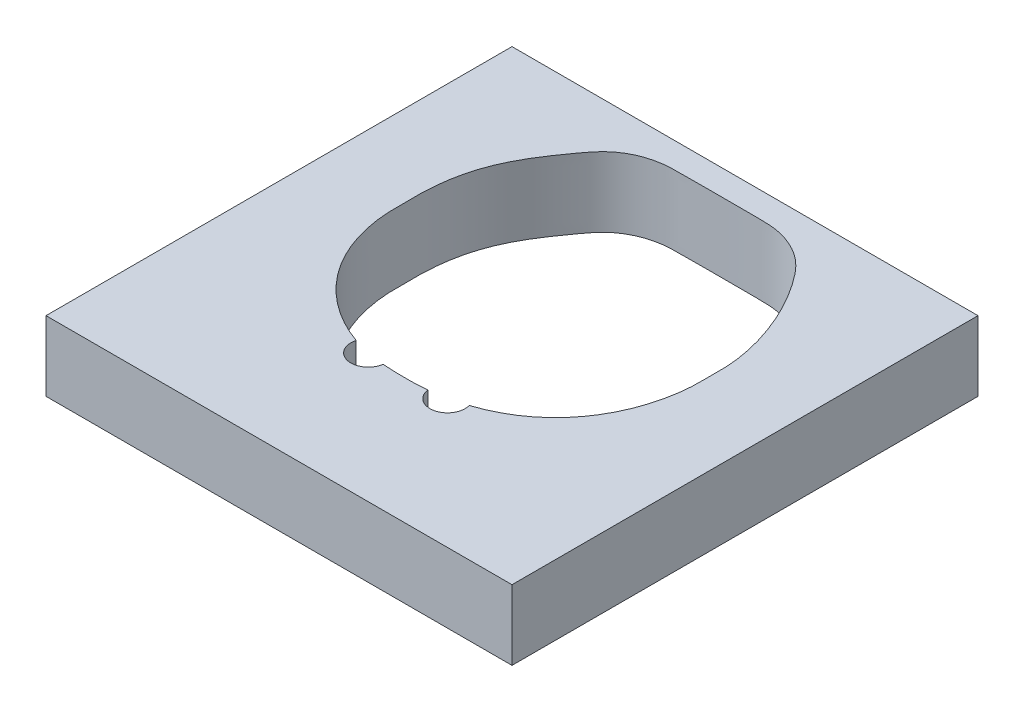
ISO-10303-21;
HEADER;
FILE_DESCRIPTION(('STEP AP214'),'2;1');
FILE_NAME('part.step','',(''),(''),'','','');
FILE_SCHEMA(('AUTOMOTIVE_DESIGN { 1 0 10303 214 1 1 1 1 }'));
ENDSEC;
DATA;
#1=APPLICATION_CONTEXT('core data for automotive mechanical design processes');
#2=APPLICATION_PROTOCOL_DEFINITION('international standard','automotive_design',2000,#1);
#3=PRODUCT_CONTEXT('',#1,'mechanical');
#4=PRODUCT('Part','Part','',(#3));
#5=PRODUCT_RELATED_PRODUCT_CATEGORY('part','',(#4));
#6=PRODUCT_DEFINITION_FORMATION('','',#4);
#7=PRODUCT_DEFINITION_CONTEXT('part definition',#1,'design');
#8=PRODUCT_DEFINITION('design','',#6,#7);
#9=PRODUCT_DEFINITION_SHAPE('','',#8);
#10=(LENGTH_UNIT() NAMED_UNIT(*) SI_UNIT(.MILLI.,.METRE.));
#11=(NAMED_UNIT(*) PLANE_ANGLE_UNIT() SI_UNIT($,.RADIAN.));
#12=(NAMED_UNIT(*) SI_UNIT($,.STERADIAN.) SOLID_ANGLE_UNIT());
#13=UNCERTAINTY_MEASURE_WITH_UNIT(LENGTH_MEASURE(1.E-05),#10,'distance_accuracy_value','');
#14=(GEOMETRIC_REPRESENTATION_CONTEXT(3) GLOBAL_UNCERTAINTY_ASSIGNED_CONTEXT((#13)) GLOBAL_UNIT_ASSIGNED_CONTEXT((#10,
#11,#12)) REPRESENTATION_CONTEXT('',''));
#15=CARTESIAN_POINT('',(0.,0.,0.));
#16=DIRECTION('',(0.,0.,1.));
#17=DIRECTION('',(1.,0.,0.));
#18=AXIS2_PLACEMENT_3D('',#15,#16,#17);
#19=CARTESIAN_POINT('',(-6.5,3.,-0.0214256179021365));
#20=CARTESIAN_POINT('',(-6.4994353161605,3.,0.000766677463345946));
#21=CARTESIAN_POINT('',(-6.49376389361778,3.,0.201339556868942));
#22=CARTESIAN_POINT('',(-6.51696723816189,3.,0.772884175907258));
#23=CARTESIAN_POINT('',(-6.12276332573033,3.,4.40404440112664));
#24=CARTESIAN_POINT('',(-3.09115744061249,3.,6.47833918697403));
#25=CARTESIAN_POINT('',(-0.424881736383483,3.,6.60745043523645));
#26=CARTESIAN_POINT('',(0.542300842859808,3.,6.62004418470608));
#27=CARTESIAN_POINT('',(4.32532450355847,3.,6.18245181467968));
#28=CARTESIAN_POINT('',(6.24560432473159,3.,3.43668929001936));
#29=CARTESIAN_POINT('',(6.5123854251507,3.,0.674969758176274));
#30=CARTESIAN_POINT('',(6.49432132460375,3.,0.00635575368141149));
#31=CARTESIAN_POINT('',(6.5548121704122,3.,-1.82425774874944));
#32=CARTESIAN_POINT('',(5.68383722274038,3.,-4.18292822463381));
#33=CARTESIAN_POINT('',(3.91331243357122,3.,-6.39372429564908));
#34=CARTESIAN_POINT('',(2.76238786705689,3.,-6.89457598920464));
#35=CARTESIAN_POINT('',(1.13006599908281,3.,-6.9136657002627));
#36=CARTESIAN_POINT('',(-0.878751888485847,3.,-6.91216839268337));
#37=CARTESIAN_POINT('',(-2.75816083109723,3.,-6.89927622220035));
#38=CARTESIAN_POINT('',(-3.9036762031933,3.,-6.44685242777281));
#39=CARTESIAN_POINT('',(-5.63278238136855,3.,-4.10255317192324));
#40=CARTESIAN_POINT('',(-6.56506313779724,3.,-2.57843233637398));
#41=CARTESIAN_POINT('',(-6.5,3.,-0.0214256179021365));
#42=B_SPLINE_CURVE_WITH_KNOTS('',3,(#19,#20,#21,#22,#23,#24,#25,#26,#27,#28,#29,#30,#31,#32,#33,
#34,#35,#36,#37,#38,#39,#40,#41),.UNSPECIFIED.,.T.,.F.,(4,1,1,1,1,1,1,1,1,1,1,1,1,1,1,1,1,1,1,1,
4),(0.,0.000975276685882154,0.00877749017293927,0.0280867828451107,0.174758910735425,
0.195439600970171,0.214212994957821,0.243278903751987,0.457032780117661,0.48570437028444,
0.501323215252997,0.520309432280292,0.656580323530094,0.680219271622173,0.733059965108999,
0.747794653096474,0.812831463509451,0.826379198459506,0.869724267646966,0.887628161165858,
0.999999999999999),.UNSPECIFIED.);
#43=DIRECTION('',(0.,-1.,0.));
#44=VECTOR('',#43,1.);
#45=SURFACE_OF_LINEAR_EXTRUSION('',#42,#44);
#46=DIRECTION('',(0.,-1.,0.));
#47=VECTOR('',#46,1.);
#48=CARTESIAN_POINT('',(-2.4219901361144,3.,6.26463301470741));
#49=LINE('',#48,#47);
#50=CARTESIAN_POINT('',(-2.42199013611445,0.,6.2646330147074));
#51=VERTEX_POINT('',#50);
#52=CARTESIAN_POINT('',(-2.42199013611445,3.,6.2646330147074));
#53=VERTEX_POINT('',#52);
#54=EDGE_CURVE('E11',#51,#53,#49,.F.);
#55=ORIENTED_EDGE('',*,*,#54,.F.);
#56=CARTESIAN_POINT('',(-6.5,0.,-0.0214256179021365));
#57=CARTESIAN_POINT('',(-6.4994353161605,0.,0.000766677463345946));
#58=CARTESIAN_POINT('',(-6.49376389361778,0.,0.201339556868942));
#59=CARTESIAN_POINT('',(-6.51696723816189,0.,0.772884175907258));
#60=CARTESIAN_POINT('',(-6.12276332573033,0.,4.40404440112664));
#61=CARTESIAN_POINT('',(-3.09115744061249,0.,6.47833918697403));
#62=CARTESIAN_POINT('',(-0.424881736383483,0.,6.60745043523645));
#63=CARTESIAN_POINT('',(0.542300842859808,0.,6.62004418470608));
#64=CARTESIAN_POINT('',(4.32532450355847,0.,6.18245181467968));
#65=CARTESIAN_POINT('',(6.24560432473159,0.,3.43668929001936));
#66=CARTESIAN_POINT('',(6.5123854251507,0.,0.674969758176274));
#67=CARTESIAN_POINT('',(6.49432132460375,0.,0.00635575368141149));
#68=CARTESIAN_POINT('',(6.5548121704122,0.,-1.82425774874944));
#69=CARTESIAN_POINT('',(5.68383722274038,0.,-4.18292822463381));
#70=CARTESIAN_POINT('',(3.91331243357122,0.,-6.39372429564908));
#71=CARTESIAN_POINT('',(2.76238786705689,0.,-6.89457598920464));
#72=CARTESIAN_POINT('',(1.13006599908281,0.,-6.9136657002627));
#73=CARTESIAN_POINT('',(-0.878751888485847,0.,-6.91216839268337));
#74=CARTESIAN_POINT('',(-2.75816083109723,0.,-6.89927622220035));
#75=CARTESIAN_POINT('',(-3.9036762031933,0.,-6.44685242777281));
#76=CARTESIAN_POINT('',(-5.63278238136855,0.,-4.10255317192324));
#77=CARTESIAN_POINT('',(-6.56506313779724,0.,-2.57843233637398));
#78=CARTESIAN_POINT('',(-6.5,0.,-0.0214256179021365));
#79=B_SPLINE_CURVE_WITH_KNOTS('',3,(#56,#57,#58,#59,#60,#61,#62,#63,#64,#65,#66,#67,#68,#69,#70,
#71,#72,#73,#74,#75,#76,#77,#78),.UNSPECIFIED.,.T.,.F.,(4,1,1,1,1,1,1,1,1,1,1,1,1,1,1,1,1,1,1,1,
4),(0.,0.000975276685882154,0.00877749017293927,0.0280867828451107,0.174758910735425,
0.195439600970171,0.214212994957821,0.243278903751987,0.457032780117661,0.48570437028444,
0.501323215252997,0.520309432280292,0.656580323530094,0.680219271622173,0.733059965108999,
0.747794653096474,0.812831463509451,0.826379198459506,0.869724267646966,0.887628161165858,
0.999999999999999),.UNSPECIFIED.);
#80=CARTESIAN_POINT('',(2.41963726154094,0.,6.25644562925793));
#81=VERTEX_POINT('',#80);
#82=EDGE_CURVE('E130',#81,#51,#79,.T.);
#83=ORIENTED_EDGE('',*,*,#82,.F.);
#84=DIRECTION('',(0.,-1.,0.));
#85=VECTOR('',#84,1.);
#86=CARTESIAN_POINT('',(2.41963726154094,3.,6.25644562925793));
#87=LINE('',#86,#85);
#88=CARTESIAN_POINT('',(2.41963726154094,3.,6.25644562925793));
#89=VERTEX_POINT('',#88);
#90=EDGE_CURVE('E107',#89,#81,#87,.T.);
#91=ORIENTED_EDGE('',*,*,#90,.F.);
#92=EDGE_CURVE('E116',#89,#53,#42,.T.);
#93=ORIENTED_EDGE('',*,*,#92,.T.);
#94=EDGE_LOOP('',(#55,#83,#91,#93));
#95=FACE_BOUND('',#94,.T.);
#96=ADVANCED_FACE('F37',(#95),#45,.T.);
#97=CARTESIAN_POINT('',(0.,3.,0.));
#98=DIRECTION('',(0.,1.,0.));
#99=DIRECTION('',(0.,0.,1.));
#100=AXIS2_PLACEMENT_3D('',#97,#98,#99);
#101=PLANE('',#100);
#102=CARTESIAN_POINT('',(-1.7,3.,6.46768533149653));
#103=DIRECTION('',(0.,1.,0.));
#104=DIRECTION('',(0.,0.,1.));
#105=AXIS2_PLACEMENT_3D('',#102,#103,#104);
#106=CIRCLE('',#105,0.75);
#107=CARTESIAN_POINT('',(-0.957690388504477,3.,6.57481348223836));
#108=VERTEX_POINT('',#107);
#109=EDGE_CURVE('E59',#53,#108,#106,.T.);
#110=ORIENTED_EDGE('',*,*,#109,.F.);
#111=ORIENTED_EDGE('',*,*,#92,.F.);
#112=CARTESIAN_POINT('',(1.7,3.,6.46768533149653));
#113=DIRECTION('',(0.,1.,0.));
#114=DIRECTION('',(0.,0.,-1.));
#115=AXIS2_PLACEMENT_3D('',#112,#113,#114);
#116=CIRCLE('',#115,0.75);
#117=CARTESIAN_POINT('',(0.956191597519683,3.,6.56385736693136));
#118=VERTEX_POINT('',#117);
#119=EDGE_CURVE('E52',#118,#89,#116,.T.);
#120=ORIENTED_EDGE('',*,*,#119,.F.);
#121=EDGE_CURVE('E114',#108,#118,#42,.T.);
#122=ORIENTED_EDGE('',*,*,#121,.F.);
#123=EDGE_LOOP('',(#110,#111,#120,#122));
#124=FACE_BOUND('',#123,.T.);
#125=DIRECTION('',(0.,0.,1.));
#126=VECTOR('',#125,1.);
#127=CARTESIAN_POINT('',(-10.,3.,-8.));
#128=LINE('',#127,#126);
#129=CARTESIAN_POINT('',(-10.,3.,-8.));
#130=VERTEX_POINT('',#129);
#131=CARTESIAN_POINT('',(-10.,3.,12.));
#132=VERTEX_POINT('',#131);
#133=EDGE_CURVE('E192',#130,#132,#128,.T.);
#134=ORIENTED_EDGE('',*,*,#133,.T.);
#135=DIRECTION('',(1.,0.,0.));
#136=VECTOR('',#135,1.);
#137=CARTESIAN_POINT('',(-10.,3.,12.));
#138=LINE('',#137,#136);
#139=CARTESIAN_POINT('',(10.,3.,12.));
#140=VERTEX_POINT('',#139);
#141=EDGE_CURVE('E199',#132,#140,#138,.T.);
#142=ORIENTED_EDGE('',*,*,#141,.T.);
#143=DIRECTION('',(0.,0.,-1.));
#144=VECTOR('',#143,1.);
#145=CARTESIAN_POINT('',(10.,3.,-8.));
#146=LINE('',#145,#144);
#147=CARTESIAN_POINT('',(10.,3.,-8.));
#148=VERTEX_POINT('',#147);
#149=EDGE_CURVE('E197',#140,#148,#146,.T.);
#150=ORIENTED_EDGE('',*,*,#149,.T.);
#151=DIRECTION('',(-1.,0.,0.));
#152=VECTOR('',#151,1.);
#153=CARTESIAN_POINT('',(-10.,3.,-8.));
#154=LINE('',#153,#152);
#155=EDGE_CURVE('E189',#148,#130,#154,.T.);
#156=ORIENTED_EDGE('',*,*,#155,.T.);
#157=EDGE_LOOP('',(#134,#142,#150,#156));
#158=FACE_BOUND('',#157,.T.);
#159=ADVANCED_FACE('F112',(#124,#158),#101,.T.);
#160=CARTESIAN_POINT('',(0.,0.,0.));
#161=DIRECTION('',(0.,1.,0.));
#162=DIRECTION('',(0.,0.,1.));
#163=AXIS2_PLACEMENT_3D('',#160,#161,#162);
#164=PLANE('',#163);
#165=DIRECTION('',(0.,0.,1.));
#166=VECTOR('',#165,1.);
#167=CARTESIAN_POINT('',(-10.,0.,-8.));
#168=LINE('',#167,#166);
#169=CARTESIAN_POINT('',(-10.,0.,-8.));
#170=VERTEX_POINT('',#169);
#171=CARTESIAN_POINT('',(-10.,0.,12.));
#172=VERTEX_POINT('',#171);
#173=EDGE_CURVE('E119',#170,#172,#168,.T.);
#174=ORIENTED_EDGE('',*,*,#173,.F.);
#175=DIRECTION('',(-1.,0.,0.));
#176=VECTOR('',#175,1.);
#177=CARTESIAN_POINT('',(-10.,0.,-8.));
#178=LINE('',#177,#176);
#179=CARTESIAN_POINT('',(10.,0.,-8.));
#180=VERTEX_POINT('',#179);
#181=EDGE_CURVE('E190',#180,#170,#178,.T.);
#182=ORIENTED_EDGE('',*,*,#181,.F.);
#183=DIRECTION('',(0.,0.,-1.));
#184=VECTOR('',#183,1.);
#185=CARTESIAN_POINT('',(10.,0.,-8.));
#186=LINE('',#185,#184);
#187=CARTESIAN_POINT('',(10.,0.,12.));
#188=VERTEX_POINT('',#187);
#189=EDGE_CURVE('E193',#188,#180,#186,.T.);
#190=ORIENTED_EDGE('',*,*,#189,.F.);
#191=DIRECTION('',(1.,0.,0.));
#192=VECTOR('',#191,1.);
#193=CARTESIAN_POINT('',(-10.,0.,12.));
#194=LINE('',#193,#192);
#195=EDGE_CURVE('E122',#172,#188,#194,.T.);
#196=ORIENTED_EDGE('',*,*,#195,.F.);
#197=EDGE_LOOP('',(#174,#182,#190,#196));
#198=FACE_BOUND('',#197,.T.);
#199=ORIENTED_EDGE('',*,*,#82,.T.);
#200=CARTESIAN_POINT('',(-1.7,0.,6.46768533149653));
#201=DIRECTION('',(0.,1.,0.));
#202=DIRECTION('',(0.,0.,1.));
#203=AXIS2_PLACEMENT_3D('',#200,#201,#202);
#204=CIRCLE('',#203,0.75);
#205=CARTESIAN_POINT('',(-0.957690388504477,0.,6.57481348223836));
#206=VERTEX_POINT('',#205);
#207=EDGE_CURVE('E171',#51,#206,#204,.T.);
#208=ORIENTED_EDGE('',*,*,#207,.T.);
#209=CARTESIAN_POINT('',(0.956191597519683,0.,6.56385736693136));
#210=VERTEX_POINT('',#209);
#211=EDGE_CURVE('E124',#206,#210,#79,.T.);
#212=ORIENTED_EDGE('',*,*,#211,.T.);
#213=CARTESIAN_POINT('',(1.7,0.,6.46768533149653));
#214=DIRECTION('',(0.,1.,0.));
#215=DIRECTION('',(0.,0.,-1.));
#216=AXIS2_PLACEMENT_3D('',#213,#214,#215);
#217=CIRCLE('',#216,0.75);
#218=EDGE_CURVE('E102',#210,#81,#217,.T.);
#219=ORIENTED_EDGE('',*,*,#218,.T.);
#220=EDGE_LOOP('',(#199,#208,#212,#219));
#221=FACE_BOUND('',#220,.T.);
#222=ADVANCED_FACE('F145',(#198,#221),#164,.F.);
#223=CARTESIAN_POINT('',(-10.,3.,-8.));
#224=DIRECTION('',(1.,0.,0.));
#225=DIRECTION('',(0.,0.,-1.));
#226=AXIS2_PLACEMENT_3D('',#223,#224,#225);
#227=PLANE('',#226);
#228=ORIENTED_EDGE('',*,*,#173,.T.);
#229=DIRECTION('',(0.,-1.,0.));
#230=VECTOR('',#229,1.);
#231=CARTESIAN_POINT('',(-10.,3.,12.));
#232=LINE('',#231,#230);
#233=EDGE_CURVE('E177',#132,#172,#232,.T.);
#234=ORIENTED_EDGE('',*,*,#233,.F.);
#235=ORIENTED_EDGE('',*,*,#133,.F.);
#236=DIRECTION('',(0.,-1.,0.));
#237=VECTOR('',#236,1.);
#238=CARTESIAN_POINT('',(-10.,3.,-8.));
#239=LINE('',#238,#237);
#240=EDGE_CURVE('E186',#130,#170,#239,.T.);
#241=ORIENTED_EDGE('',*,*,#240,.T.);
#242=EDGE_LOOP('',(#228,#234,#235,#241));
#243=FACE_BOUND('',#242,.T.);
#244=ADVANCED_FACE('F39',(#243),#227,.F.);
#245=CARTESIAN_POINT('',(-10.,3.,12.));
#246=DIRECTION('',(0.,0.,-1.));
#247=DIRECTION('',(-1.,0.,0.));
#248=AXIS2_PLACEMENT_3D('',#245,#246,#247);
#249=PLANE('',#248);
#250=ORIENTED_EDGE('',*,*,#195,.T.);
#251=DIRECTION('',(0.,-1.,0.));
#252=VECTOR('',#251,1.);
#253=CARTESIAN_POINT('',(10.,3.,12.));
#254=LINE('',#253,#252);
#255=EDGE_CURVE('E180',#140,#188,#254,.T.);
#256=ORIENTED_EDGE('',*,*,#255,.F.);
#257=ORIENTED_EDGE('',*,*,#141,.F.);
#258=ORIENTED_EDGE('',*,*,#233,.T.);
#259=EDGE_LOOP('',(#250,#256,#257,#258));
#260=FACE_BOUND('',#259,.T.);
#261=ADVANCED_FACE('F154',(#260),#249,.F.);
#262=CARTESIAN_POINT('',(10.,3.,-8.));
#263=DIRECTION('',(-1.,0.,0.));
#264=DIRECTION('',(0.,0.,1.));
#265=AXIS2_PLACEMENT_3D('',#262,#263,#264);
#266=PLANE('',#265);
#267=ORIENTED_EDGE('',*,*,#189,.T.);
#268=DIRECTION('',(0.,-1.,0.));
#269=VECTOR('',#268,1.);
#270=CARTESIAN_POINT('',(10.,3.,-8.));
#271=LINE('',#270,#269);
#272=EDGE_CURVE('E183',#148,#180,#271,.T.);
#273=ORIENTED_EDGE('',*,*,#272,.F.);
#274=ORIENTED_EDGE('',*,*,#149,.F.);
#275=ORIENTED_EDGE('',*,*,#255,.T.);
#276=EDGE_LOOP('',(#267,#273,#274,#275));
#277=FACE_BOUND('',#276,.T.);
#278=ADVANCED_FACE('F151',(#277),#266,.F.);
#279=CARTESIAN_POINT('',(-10.,3.,-8.));
#280=DIRECTION('',(0.,0.,1.));
#281=DIRECTION('',(1.,0.,0.));
#282=AXIS2_PLACEMENT_3D('',#279,#280,#281);
#283=PLANE('',#282);
#284=ORIENTED_EDGE('',*,*,#181,.T.);
#285=ORIENTED_EDGE('',*,*,#240,.F.);
#286=ORIENTED_EDGE('',*,*,#155,.F.);
#287=ORIENTED_EDGE('',*,*,#272,.T.);
#288=EDGE_LOOP('',(#284,#285,#286,#287));
#289=FACE_BOUND('',#288,.T.);
#290=ADVANCED_FACE('F141',(#289),#283,.F.);
#291=DIRECTION('',(0.,-1.,0.));
#292=VECTOR('',#291,1.);
#293=CARTESIAN_POINT('',(-0.957690388504477,3.,6.57481348223836));
#294=LINE('',#293,#292);
#295=EDGE_CURVE('E45',#108,#206,#294,.T.);
#296=ORIENTED_EDGE('',*,*,#295,.F.);
#297=ORIENTED_EDGE('',*,*,#121,.T.);
#298=DIRECTION('',(0.,-1.,0.));
#299=VECTOR('',#298,1.);
#300=CARTESIAN_POINT('',(0.956191597519683,3.,6.56385736693136));
#301=LINE('',#300,#299);
#302=EDGE_CURVE('E99',#210,#118,#301,.F.);
#303=ORIENTED_EDGE('',*,*,#302,.F.);
#304=ORIENTED_EDGE('',*,*,#211,.F.);
#305=EDGE_LOOP('',(#296,#297,#303,#304));
#306=FACE_BOUND('',#305,.T.);
#307=ADVANCED_FACE('F118',(#306),#45,.T.);
#308=CARTESIAN_POINT('',(1.7,0.,6.46768533149653));
#309=DIRECTION('',(0.,1.,0.));
#310=DIRECTION('',(0.,0.,1.));
#311=AXIS2_PLACEMENT_3D('',#308,#309,#310);
#312=CYLINDRICAL_SURFACE('',#311,0.75);
#313=ORIENTED_EDGE('',*,*,#302,.T.);
#314=ORIENTED_EDGE('',*,*,#119,.T.);
#315=ORIENTED_EDGE('',*,*,#90,.T.);
#316=ORIENTED_EDGE('',*,*,#218,.F.);
#317=EDGE_LOOP('',(#313,#314,#315,#316));
#318=FACE_BOUND('',#317,.T.);
#319=ADVANCED_FACE('F100',(#318),#312,.F.);
#320=CARTESIAN_POINT('',(-1.7,0.,6.46768533149653));
#321=DIRECTION('',(0.,1.,0.));
#322=DIRECTION('',(0.,0.,1.));
#323=AXIS2_PLACEMENT_3D('',#320,#321,#322);
#324=CYLINDRICAL_SURFACE('',#323,0.75);
#325=ORIENTED_EDGE('',*,*,#54,.T.);
#326=ORIENTED_EDGE('',*,*,#109,.T.);
#327=ORIENTED_EDGE('',*,*,#295,.T.);
#328=ORIENTED_EDGE('',*,*,#207,.F.);
#329=EDGE_LOOP('',(#325,#326,#327,#328));
#330=FACE_BOUND('',#329,.T.);
#331=ADVANCED_FACE('F174',(#330),#324,.F.);
#332=CLOSED_SHELL('',(#96,#159,#222,#244,#261,#278,#290,#307,#319,#331));
#333=MANIFOLD_SOLID_BREP('B2',#332);
#334=ADVANCED_BREP_SHAPE_REPRESENTATION('',(#18,#333),#14);
#335=SHAPE_DEFINITION_REPRESENTATION(#9,#334);
ENDSEC;
END-ISO-10303-21;
